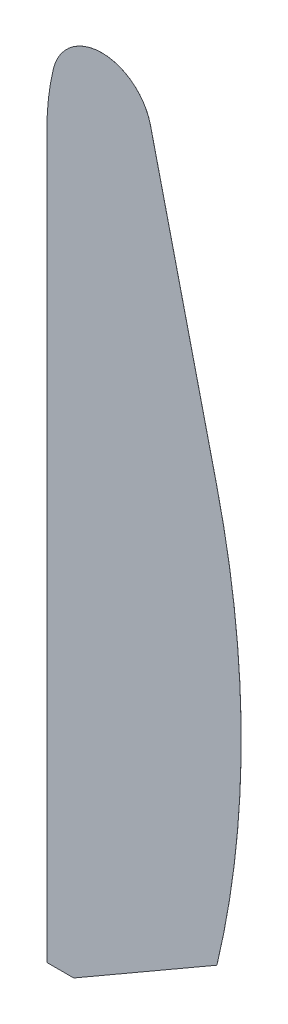
ISO-10303-21;
HEADER;
FILE_DESCRIPTION(('STEP AP214'),'2;1');
FILE_NAME('part.step','',(''),(''),'','','');
FILE_SCHEMA(('AUTOMOTIVE_DESIGN { 1 0 10303 214 1 1 1 1 }'));
ENDSEC;
DATA;
#1=APPLICATION_CONTEXT('core data for automotive mechanical design processes');
#2=APPLICATION_PROTOCOL_DEFINITION('international standard','automotive_design',2000,#1);
#3=PRODUCT_CONTEXT('',#1,'mechanical');
#4=PRODUCT('Part','Part','',(#3));
#5=PRODUCT_RELATED_PRODUCT_CATEGORY('part','',(#4));
#6=PRODUCT_DEFINITION_FORMATION('','',#4);
#7=PRODUCT_DEFINITION_CONTEXT('part definition',#1,'design');
#8=PRODUCT_DEFINITION('design','',#6,#7);
#9=PRODUCT_DEFINITION_SHAPE('','',#8);
#10=(LENGTH_UNIT() NAMED_UNIT(*) SI_UNIT(.MILLI.,.METRE.));
#11=(NAMED_UNIT(*) PLANE_ANGLE_UNIT() SI_UNIT($,.RADIAN.));
#12=(NAMED_UNIT(*) SI_UNIT($,.STERADIAN.) SOLID_ANGLE_UNIT());
#13=UNCERTAINTY_MEASURE_WITH_UNIT(LENGTH_MEASURE(1.E-05),#10,'distance_accuracy_value','');
#14=(GEOMETRIC_REPRESENTATION_CONTEXT(3) GLOBAL_UNCERTAINTY_ASSIGNED_CONTEXT((#13)) GLOBAL_UNIT_ASSIGNED_CONTEXT((#10,
#11,#12)) REPRESENTATION_CONTEXT('',''));
#15=CARTESIAN_POINT('',(0.,0.,0.));
#16=DIRECTION('',(0.,0.,1.));
#17=DIRECTION('',(1.,0.,0.));
#18=AXIS2_PLACEMENT_3D('',#15,#16,#17);
#19=CARTESIAN_POINT('',(10.251582354558,142.847091381213,0.01));
#20=DIRECTION('',(0.,0.,-1.));
#21=DIRECTION('',(-1.,0.,0.));
#22=AXIS2_PLACEMENT_3D('',#19,#20,#21);
#23=CYLINDRICAL_SURFACE('',#22,9.31471533493349);
#24=CARTESIAN_POINT('',(10.251582354558,142.847091381213,0.));
#25=DIRECTION('',(0.,0.,-1.));
#26=DIRECTION('',(-1.,0.,0.));
#27=AXIS2_PLACEMENT_3D('',#24,#25,#26);
#28=CIRCLE('',#27,9.31471533493349);
#29=CARTESIAN_POINT('',(1.18908235455804,145.,0.));
#30=VERTEX_POINT('',#29);
#31=CARTESIAN_POINT('',(19.314082354558,145.,0.));
#32=VERTEX_POINT('',#31);
#33=EDGE_CURVE('E127',#30,#32,#28,.T.);
#34=ORIENTED_EDGE('',*,*,#33,.F.);
#35=DIRECTION('',(0.,0.,-1.));
#36=VECTOR('',#35,1.);
#37=CARTESIAN_POINT('',(1.18908235455804,145.,0.01));
#38=LINE('',#37,#36);
#39=CARTESIAN_POINT('',(1.18908235455804,145.,0.01));
#40=VERTEX_POINT('',#39);
#41=EDGE_CURVE('E11',#40,#30,#38,.T.);
#42=ORIENTED_EDGE('',*,*,#41,.F.);
#43=CARTESIAN_POINT('',(10.251582354558,142.847091381213,0.01));
#44=DIRECTION('',(0.,0.,-1.));
#45=DIRECTION('',(-1.,0.,0.));
#46=AXIS2_PLACEMENT_3D('',#43,#44,#45);
#47=CIRCLE('',#46,9.31471533493349);
#48=CARTESIAN_POINT('',(19.314082354558,145.,0.01));
#49=VERTEX_POINT('',#48);
#50=EDGE_CURVE('E142',#40,#49,#47,.T.);
#51=ORIENTED_EDGE('',*,*,#50,.T.);
#52=DIRECTION('',(0.,0.,-1.));
#53=VECTOR('',#52,1.);
#54=CARTESIAN_POINT('',(19.314082354558,145.,0.01));
#55=LINE('',#54,#53);
#56=EDGE_CURVE('E41',#49,#32,#55,.T.);
#57=ORIENTED_EDGE('',*,*,#56,.T.);
#58=EDGE_LOOP('',(#34,#42,#51,#57));
#59=FACE_BOUND('',#58,.T.);
#60=ADVANCED_FACE('F36',(#59),#23,.T.);
#61=CARTESIAN_POINT('',(43.9147113930293,134.85,0.01));
#62=DIRECTION('',(0.,0.,-1.));
#63=DIRECTION('',(-1.,0.,0.));
#64=AXIS2_PLACEMENT_3D('',#61,#62,#63);
#65=CYLINDRICAL_SURFACE('',#64,43.9147113930293);
#66=CARTESIAN_POINT('',(43.9147113930293,134.85,0.));
#67=DIRECTION('',(0.,0.,-1.));
#68=DIRECTION('',(-1.,0.,0.));
#69=AXIS2_PLACEMENT_3D('',#66,#67,#68);
#70=CIRCLE('',#69,43.9147113930293);
#71=CARTESIAN_POINT('',(0.,134.85,0.));
#72=VERTEX_POINT('',#71);
#73=EDGE_CURVE('E139',#72,#30,#70,.T.);
#74=ORIENTED_EDGE('',*,*,#73,.F.);
#75=DIRECTION('',(0.,0.,-1.));
#76=VECTOR('',#75,1.);
#77=CARTESIAN_POINT('',(0.,134.85,0.01));
#78=LINE('',#77,#76);
#79=CARTESIAN_POINT('',(0.,134.85,0.01));
#80=VERTEX_POINT('',#79);
#81=EDGE_CURVE('E50',#80,#72,#78,.T.);
#82=ORIENTED_EDGE('',*,*,#81,.F.);
#83=CARTESIAN_POINT('',(43.9147113930293,134.85,0.01));
#84=DIRECTION('',(0.,0.,-1.));
#85=DIRECTION('',(-1.,0.,0.));
#86=AXIS2_PLACEMENT_3D('',#83,#84,#85);
#87=CIRCLE('',#86,43.9147113930293);
#88=EDGE_CURVE('E122',#80,#40,#87,.T.);
#89=ORIENTED_EDGE('',*,*,#88,.T.);
#90=ORIENTED_EDGE('',*,*,#41,.T.);
#91=EDGE_LOOP('',(#74,#82,#89,#90));
#92=FACE_BOUND('',#91,.T.);
#93=ADVANCED_FACE('F152',(#92),#65,.T.);
#94=CARTESIAN_POINT('',(0.,0.,0.01));
#95=DIRECTION('',(-1.,0.,0.));
#96=DIRECTION('',(0.,0.,1.));
#97=AXIS2_PLACEMENT_3D('',#94,#95,#96);
#98=PLANE('',#97);
#99=DIRECTION('',(0.,1.,0.));
#100=VECTOR('',#99,1.);
#101=CARTESIAN_POINT('',(0.,0.,0.));
#102=LINE('',#101,#100);
#103=CARTESIAN_POINT('',(0.,0.,0.));
#104=VERTEX_POINT('',#103);
#105=EDGE_CURVE('E110',#104,#72,#102,.T.);
#106=ORIENTED_EDGE('',*,*,#105,.F.);
#107=DIRECTION('',(0.,0.,-1.));
#108=VECTOR('',#107,1.);
#109=CARTESIAN_POINT('',(0.,0.,0.01));
#110=LINE('',#109,#108);
#111=CARTESIAN_POINT('',(0.,0.,0.01));
#112=VERTEX_POINT('',#111);
#113=EDGE_CURVE('E101',#112,#104,#110,.T.);
#114=ORIENTED_EDGE('',*,*,#113,.F.);
#115=DIRECTION('',(0.,1.,0.));
#116=VECTOR('',#115,1.);
#117=CARTESIAN_POINT('',(0.,0.,0.01));
#118=LINE('',#117,#116);
#119=EDGE_CURVE('E104',#112,#80,#118,.T.);
#120=ORIENTED_EDGE('',*,*,#119,.T.);
#121=ORIENTED_EDGE('',*,*,#81,.T.);
#122=EDGE_LOOP('',(#106,#114,#120,#121));
#123=FACE_BOUND('',#122,.T.);
#124=ADVANCED_FACE('F103',(#123),#98,.T.);
#125=CARTESIAN_POINT('',(0.,0.,0.01));
#126=DIRECTION('',(0.,1.,0.));
#127=DIRECTION('',(-1.,0.,0.));
#128=AXIS2_PLACEMENT_3D('',#125,#126,#127);
#129=PLANE('',#128);
#130=DIRECTION('',(1.,0.,0.));
#131=VECTOR('',#130,1.);
#132=CARTESIAN_POINT('',(0.,0.,0.));
#133=LINE('',#132,#131);
#134=CARTESIAN_POINT('',(5.,0.,0.));
#135=VERTEX_POINT('',#134);
#136=EDGE_CURVE('E140',#104,#135,#133,.T.);
#137=ORIENTED_EDGE('',*,*,#136,.T.);
#138=DIRECTION('',(0.,0.,-1.));
#139=VECTOR('',#138,1.);
#140=CARTESIAN_POINT('',(5.,0.,0.01));
#141=LINE('',#140,#139);
#142=CARTESIAN_POINT('',(5.,0.,0.01));
#143=VERTEX_POINT('',#142);
#144=EDGE_CURVE('E109',#143,#135,#141,.T.);
#145=ORIENTED_EDGE('',*,*,#144,.F.);
#146=DIRECTION('',(1.,0.,0.));
#147=VECTOR('',#146,1.);
#148=CARTESIAN_POINT('',(0.,0.,0.01));
#149=LINE('',#148,#147);
#150=EDGE_CURVE('E114',#112,#143,#149,.T.);
#151=ORIENTED_EDGE('',*,*,#150,.F.);
#152=ORIENTED_EDGE('',*,*,#113,.T.);
#153=EDGE_LOOP('',(#137,#145,#151,#152));
#154=FACE_BOUND('',#153,.T.);
#155=ADVANCED_FACE('F111',(#154),#129,.F.);
#156=CARTESIAN_POINT('',(5.,0.,0.01));
#157=DIRECTION('',(-0.500000000000001,0.866025403784438,0.));
#158=DIRECTION('',(-0.866025403784438,-0.500000000000001,0.));
#159=AXIS2_PLACEMENT_3D('',#156,#157,#158);
#160=PLANE('',#159);
#161=DIRECTION('',(0.866025403784438,0.500000000000001,0.));
#162=VECTOR('',#161,1.);
#163=CARTESIAN_POINT('',(5.,0.,0.));
#164=LINE('',#163,#162);
#165=CARTESIAN_POINT('',(31.71875,15.4260775049103,0.));
#166=VERTEX_POINT('',#165);
#167=EDGE_CURVE('E132',#135,#166,#164,.T.);
#168=ORIENTED_EDGE('',*,*,#167,.T.);
#169=DIRECTION('',(0.,0.,-1.));
#170=VECTOR('',#169,1.);
#171=CARTESIAN_POINT('',(31.71875,15.4260775049103,0.01));
#172=LINE('',#171,#170);
#173=CARTESIAN_POINT('',(31.71875,15.4260775049103,0.01));
#174=VERTEX_POINT('',#173);
#175=EDGE_CURVE('E148',#174,#166,#172,.T.);
#176=ORIENTED_EDGE('',*,*,#175,.F.);
#177=DIRECTION('',(0.866025403784438,0.500000000000001,0.));
#178=VECTOR('',#177,1.);
#179=CARTESIAN_POINT('',(5.,0.,0.01));
#180=LINE('',#179,#178);
#181=EDGE_CURVE('E120',#143,#174,#180,.T.);
#182=ORIENTED_EDGE('',*,*,#181,.F.);
#183=ORIENTED_EDGE('',*,*,#144,.T.);
#184=EDGE_LOOP('',(#168,#176,#182,#183));
#185=FACE_BOUND('',#184,.T.);
#186=ADVANCED_FACE('F170',(#185),#160,.F.);
#187=CARTESIAN_POINT('',(-131.096303001548,54.1048009118305,0.01));
#188=DIRECTION('',(0.,0.,-1.));
#189=DIRECTION('',(-1.,0.,0.));
#190=AXIS2_PLACEMENT_3D('',#187,#188,#189);
#191=CYLINDRICAL_SURFACE('',#190,167.346303001548);
#192=CARTESIAN_POINT('',(-131.096303001548,54.1048009118305,0.));
#193=DIRECTION('',(0.,0.,1.));
#194=DIRECTION('',(1.,0.,0.));
#195=AXIS2_PLACEMENT_3D('',#192,#193,#194);
#196=CIRCLE('',#195,167.346303001548);
#197=CARTESIAN_POINT('',(31.71875,92.7835243187507,0.));
#198=VERTEX_POINT('',#197);
#199=EDGE_CURVE('E131',#166,#198,#196,.T.);
#200=ORIENTED_EDGE('',*,*,#199,.T.);
#201=DIRECTION('',(0.,0.,-1.));
#202=VECTOR('',#201,1.);
#203=CARTESIAN_POINT('',(31.71875,92.7835243187507,0.01));
#204=LINE('',#203,#202);
#205=CARTESIAN_POINT('',(31.71875,92.7835243187507,0.01));
#206=VERTEX_POINT('',#205);
#207=EDGE_CURVE('E146',#206,#198,#204,.T.);
#208=ORIENTED_EDGE('',*,*,#207,.F.);
#209=CARTESIAN_POINT('',(-131.096303001548,54.1048009118305,0.01));
#210=DIRECTION('',(0.,0.,1.));
#211=DIRECTION('',(1.,0.,0.));
#212=AXIS2_PLACEMENT_3D('',#209,#210,#211);
#213=CIRCLE('',#212,167.346303001548);
#214=EDGE_CURVE('E235',#174,#206,#213,.T.);
#215=ORIENTED_EDGE('',*,*,#214,.F.);
#216=ORIENTED_EDGE('',*,*,#175,.T.);
#217=EDGE_LOOP('',(#200,#208,#215,#216));
#218=FACE_BOUND('',#217,.T.);
#219=ADVANCED_FACE('F168',(#218),#191,.T.);
#220=CARTESIAN_POINT('',(19.314082354558,145.,0.01));
#221=DIRECTION('',(0.972922915423126,0.231129835037721,0.));
#222=DIRECTION('',(-0.231129835037721,0.972922915423126,0.));
#223=AXIS2_PLACEMENT_3D('',#220,#221,#222);
#224=PLANE('',#223);
#225=DIRECTION('',(0.231129835037721,-0.972922915423126,0.));
#226=VECTOR('',#225,1.);
#227=CARTESIAN_POINT('',(19.314082354558,145.,0.));
#228=LINE('',#227,#226);
#229=EDGE_CURVE('E129',#32,#198,#228,.T.);
#230=ORIENTED_EDGE('',*,*,#229,.F.);
#231=ORIENTED_EDGE('',*,*,#56,.F.);
#232=DIRECTION('',(0.231129835037721,-0.972922915423126,0.));
#233=VECTOR('',#232,1.);
#234=CARTESIAN_POINT('',(19.314082354558,145.,0.01));
#235=LINE('',#234,#233);
#236=EDGE_CURVE('E233',#49,#206,#235,.T.);
#237=ORIENTED_EDGE('',*,*,#236,.T.);
#238=ORIENTED_EDGE('',*,*,#207,.T.);
#239=EDGE_LOOP('',(#230,#231,#237,#238));
#240=FACE_BOUND('',#239,.T.);
#241=ADVANCED_FACE('F147',(#240),#224,.T.);
#242=CARTESIAN_POINT('',(10.251582354558,142.847091381213,0.01));
#243=DIRECTION('',(0.,0.,-1.));
#244=DIRECTION('',(-1.,0.,0.));
#245=AXIS2_PLACEMENT_3D('',#242,#243,#244);
#246=PLANE('',#245);
#247=ORIENTED_EDGE('',*,*,#50,.F.);
#248=ORIENTED_EDGE('',*,*,#88,.F.);
#249=ORIENTED_EDGE('',*,*,#119,.F.);
#250=ORIENTED_EDGE('',*,*,#150,.T.);
#251=ORIENTED_EDGE('',*,*,#181,.T.);
#252=ORIENTED_EDGE('',*,*,#214,.T.);
#253=ORIENTED_EDGE('',*,*,#236,.F.);
#254=EDGE_LOOP('',(#247,#248,#249,#250,#251,#252,#253));
#255=FACE_BOUND('',#254,.T.);
#256=ADVANCED_FACE('F117',(#255),#246,.F.);
#257=CARTESIAN_POINT('',(10.251582354558,142.847091381213,0.));
#258=DIRECTION('',(0.,0.,-1.));
#259=DIRECTION('',(-1.,0.,0.));
#260=AXIS2_PLACEMENT_3D('',#257,#258,#259);
#261=PLANE('',#260);
#262=ORIENTED_EDGE('',*,*,#33,.T.);
#263=ORIENTED_EDGE('',*,*,#229,.T.);
#264=ORIENTED_EDGE('',*,*,#199,.F.);
#265=ORIENTED_EDGE('',*,*,#167,.F.);
#266=ORIENTED_EDGE('',*,*,#136,.F.);
#267=ORIENTED_EDGE('',*,*,#105,.T.);
#268=ORIENTED_EDGE('',*,*,#73,.T.);
#269=EDGE_LOOP('',(#262,#263,#264,#265,#266,#267,#268));
#270=FACE_BOUND('',#269,.T.);
#271=ADVANCED_FACE('F153',(#270),#261,.T.);
#272=CLOSED_SHELL('',(#60,#93,#124,#155,#186,#219,#241,#256,#271));
#273=MANIFOLD_SOLID_BREP('B2',#272);
#274=ADVANCED_BREP_SHAPE_REPRESENTATION('',(#18,#273),#14);
#275=SHAPE_DEFINITION_REPRESENTATION(#9,#274);
ENDSEC;
END-ISO-10303-21;
